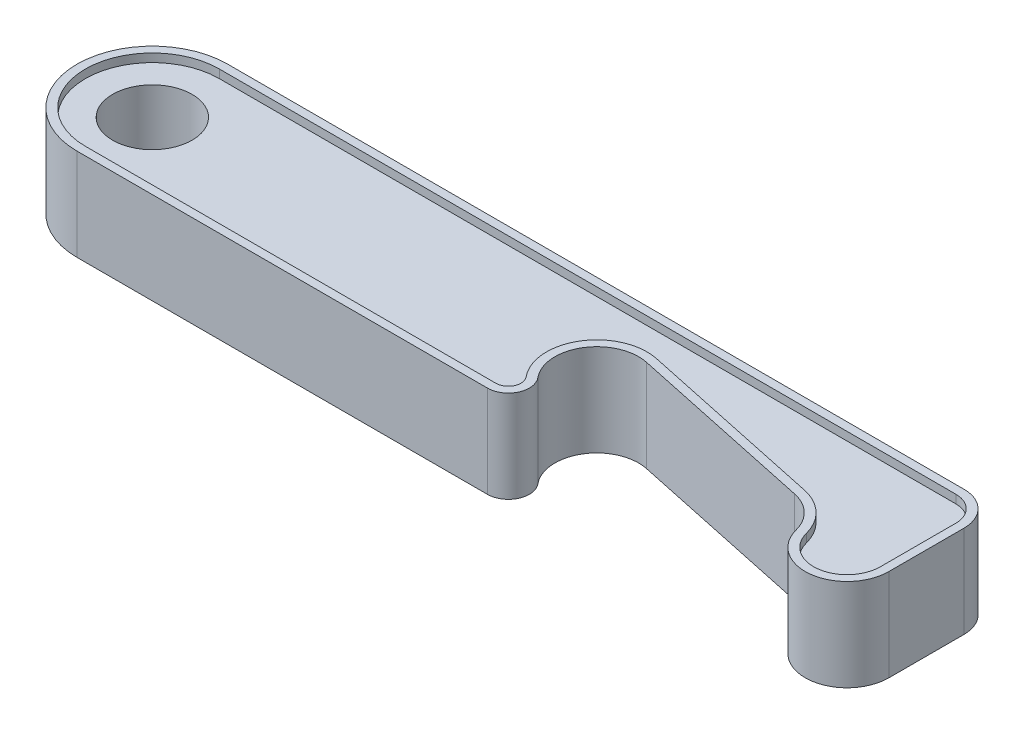
ISO-10303-21;
HEADER;
FILE_DESCRIPTION(('STEP AP214'),'2;1');
FILE_NAME('part.step','',(''),(''),'','','');
FILE_SCHEMA(('AUTOMOTIVE_DESIGN { 1 0 10303 214 1 1 1 1 }'));
ENDSEC;
DATA;
#1=APPLICATION_CONTEXT('core data for automotive mechanical design processes');
#2=APPLICATION_PROTOCOL_DEFINITION('international standard','automotive_design',2000,#1);
#3=PRODUCT_CONTEXT('',#1,'mechanical');
#4=PRODUCT('Part','Part','',(#3));
#5=PRODUCT_RELATED_PRODUCT_CATEGORY('part','',(#4));
#6=PRODUCT_DEFINITION_FORMATION('','',#4);
#7=PRODUCT_DEFINITION_CONTEXT('part definition',#1,'design');
#8=PRODUCT_DEFINITION('design','',#6,#7);
#9=PRODUCT_DEFINITION_SHAPE('','',#8);
#10=(LENGTH_UNIT() NAMED_UNIT(*) SI_UNIT(.MILLI.,.METRE.));
#11=(NAMED_UNIT(*) PLANE_ANGLE_UNIT() SI_UNIT($,.RADIAN.));
#12=(NAMED_UNIT(*) SI_UNIT($,.STERADIAN.) SOLID_ANGLE_UNIT());
#13=UNCERTAINTY_MEASURE_WITH_UNIT(LENGTH_MEASURE(1.E-05),#10,'distance_accuracy_value','');
#14=(GEOMETRIC_REPRESENTATION_CONTEXT(3) GLOBAL_UNCERTAINTY_ASSIGNED_CONTEXT((#13)) GLOBAL_UNIT_ASSIGNED_CONTEXT((#10,
#11,#12)) REPRESENTATION_CONTEXT('',''));
#15=CARTESIAN_POINT('',(0.,0.,0.));
#16=DIRECTION('',(0.,0.,1.));
#17=DIRECTION('',(1.,0.,0.));
#18=AXIS2_PLACEMENT_3D('',#15,#16,#17);
#19=CARTESIAN_POINT('',(0.,4.5,0.));
#20=DIRECTION('',(0.,-1.,0.));
#21=DIRECTION('',(0.,0.,-1.));
#22=AXIS2_PLACEMENT_3D('',#19,#20,#21);
#23=CYLINDRICAL_SURFACE('',#22,4.75);
#24=CARTESIAN_POINT('',(0.,4.5,0.));
#25=DIRECTION('',(0.,1.,0.));
#26=DIRECTION('',(0.,0.,1.));
#27=AXIS2_PLACEMENT_3D('',#24,#25,#26);
#28=CIRCLE('',#27,4.75);
#29=CARTESIAN_POINT('',(0.,4.5,4.75));
#30=VERTEX_POINT('',#29);
#31=EDGE_CURVE('E94',#30,#30,#28,.T.);
#32=ORIENTED_EDGE('',*,*,#31,.T.);
#33=EDGE_LOOP('',(#32));
#34=FACE_BOUND('',#33,.T.);
#35=CARTESIAN_POINT('',(0.,-4.5,0.));
#36=DIRECTION('',(0.,1.,0.));
#37=DIRECTION('',(0.,0.,1.));
#38=AXIS2_PLACEMENT_3D('',#35,#36,#37);
#39=CIRCLE('',#38,4.75);
#40=CARTESIAN_POINT('',(0.,-4.5,4.75));
#41=VERTEX_POINT('',#40);
#42=EDGE_CURVE('E154',#41,#41,#39,.T.);
#43=ORIENTED_EDGE('',*,*,#42,.F.);
#44=EDGE_LOOP('',(#43));
#45=FACE_BOUND('',#44,.T.);
#46=ADVANCED_FACE('F36',(#34,#45),#23,.F.);
#47=CARTESIAN_POINT('',(0.,4.5,0.));
#48=DIRECTION('',(0.,1.,0.));
#49=DIRECTION('',(0.,0.,1.));
#50=AXIS2_PLACEMENT_3D('',#47,#48,#49);
#51=PLANE('',#50);
#52=ORIENTED_EDGE('',*,*,#31,.F.);
#53=EDGE_LOOP('',(#52));
#54=FACE_BOUND('',#53,.T.);
#55=DIRECTION('',(1.,0.,0.));
#56=VECTOR('',#55,1.);
#57=CARTESIAN_POINT('',(0.,4.5,-8.));
#58=LINE('',#57,#56);
#59=CARTESIAN_POINT('',(0.,4.5,-8.));
#60=VERTEX_POINT('',#59);
#61=CARTESIAN_POINT('',(88.,4.5,-8.));
#62=VERTEX_POINT('',#61);
#63=EDGE_CURVE('E129',#60,#62,#58,.T.);
#64=ORIENTED_EDGE('',*,*,#63,.F.);
#65=CARTESIAN_POINT('',(0.,4.5,0.));
#66=DIRECTION('',(0.,1.,0.));
#67=DIRECTION('',(0.,0.,1.));
#68=AXIS2_PLACEMENT_3D('',#65,#66,#67);
#69=CIRCLE('',#68,8.);
#70=CARTESIAN_POINT('',(0.,4.5,8.));
#71=VERTEX_POINT('',#70);
#72=EDGE_CURVE('E132',#60,#71,#69,.T.);
#73=ORIENTED_EDGE('',*,*,#72,.T.);
#74=DIRECTION('',(1.,0.,0.));
#75=VECTOR('',#74,1.);
#76=CARTESIAN_POINT('',(0.,4.5,8.));
#77=LINE('',#76,#75);
#78=CARTESIAN_POINT('',(49.0402172346334,4.5,8.));
#79=VERTEX_POINT('',#78);
#80=EDGE_CURVE('E135',#71,#79,#77,.T.);
#81=ORIENTED_EDGE('',*,*,#80,.T.);
#82=CARTESIAN_POINT('',(49.0402172346334,4.5,6.5));
#83=DIRECTION('',(0.,1.,0.));
#84=DIRECTION('',(0.,0.,1.));
#85=AXIS2_PLACEMENT_3D('',#82,#83,#84);
#86=CIRCLE('',#85,1.5);
#87=CARTESIAN_POINT('',(50.195682114603,4.5,5.54349547248493));
#88=VERTEX_POINT('',#87);
#89=EDGE_CURVE('E138',#88,#79,#86,.F.);
#90=ORIENTED_EDGE('',*,*,#89,.F.);
#91=CARTESIAN_POINT('',(54.8175416344815,4.5,1.71747736242466));
#92=DIRECTION('',(0.,1.,0.));
#93=DIRECTION('',(0.,0.,1.));
#94=AXIS2_PLACEMENT_3D('',#91,#92,#93);
#95=CIRCLE('',#94,6.);
#96=CARTESIAN_POINT('',(56.065011779388,4.5,-4.15140824197818));
#97=VERTEX_POINT('',#96);
#98=EDGE_CURVE('E140',#97,#88,#95,.T.);
#99=ORIENTED_EDGE('',*,*,#98,.F.);
#100=DIRECTION('',(-0.978147600733807,0.,-0.207911690817753));
#101=VECTOR('',#100,1.);
#102=CARTESIAN_POINT('',(3.26780239401411,4.5,-15.3738015347051));
#103=LINE('',#102,#101);
#104=CARTESIAN_POINT('',(78.565011779388,4.5,0.631114395597154));
#105=VERTEX_POINT('',#104);
#106=EDGE_CURVE('E143',#105,#97,#103,.T.);
#107=ORIENTED_EDGE('',*,*,#106,.F.);
#108=CARTESIAN_POINT('',(77.3175416344815,4.5,6.5));
#109=DIRECTION('',(0.,1.,0.));
#110=DIRECTION('',(0.,0.,1.));
#111=AXIS2_PLACEMENT_3D('',#108,#109,#110);
#112=CIRCLE('',#111,6.);
#113=CARTESIAN_POINT('',(83.1270166537926,4.5,5.));
#114=VERTEX_POINT('',#113);
#115=EDGE_CURVE('E146',#114,#105,#112,.T.);
#116=ORIENTED_EDGE('',*,*,#115,.F.);
#117=CARTESIAN_POINT('',(87.,4.5,4.));
#118=DIRECTION('',(0.,1.,0.));
#119=DIRECTION('',(0.,0.,1.));
#120=AXIS2_PLACEMENT_3D('',#117,#118,#119);
#121=CIRCLE('',#120,4.);
#122=CARTESIAN_POINT('',(91.,4.5,4.));
#123=VERTEX_POINT('',#122);
#124=EDGE_CURVE('E149',#123,#114,#121,.F.);
#125=ORIENTED_EDGE('',*,*,#124,.F.);
#126=DIRECTION('',(0.,0.,1.));
#127=VECTOR('',#126,1.);
#128=CARTESIAN_POINT('',(91.,4.5,0.));
#129=LINE('',#128,#127);
#130=CARTESIAN_POINT('',(91.,4.5,-5.));
#131=VERTEX_POINT('',#130);
#132=EDGE_CURVE('E45',#131,#123,#129,.T.);
#133=ORIENTED_EDGE('',*,*,#132,.F.);
#134=CARTESIAN_POINT('',(88.,4.5,-5.));
#135=DIRECTION('',(0.,1.,0.));
#136=DIRECTION('',(0.,0.,1.));
#137=AXIS2_PLACEMENT_3D('',#134,#135,#136);
#138=CIRCLE('',#137,3.);
#139=EDGE_CURVE('E11',#62,#131,#138,.F.);
#140=ORIENTED_EDGE('',*,*,#139,.F.);
#141=EDGE_LOOP('',(#64,#73,#81,#90,#99,#107,#116,#125,#133,#140));
#142=FACE_BOUND('',#141,.T.);
#143=ADVANCED_FACE('F470',(#54,#142),#51,.T.);
#144=CARTESIAN_POINT('',(0.,-4.5,0.));
#145=DIRECTION('',(0.,1.,0.));
#146=DIRECTION('',(0.,0.,1.));
#147=AXIS2_PLACEMENT_3D('',#144,#145,#146);
#148=PLANE('',#147);
#149=ORIENTED_EDGE('',*,*,#42,.T.);
#150=EDGE_LOOP('',(#149));
#151=FACE_BOUND('',#150,.T.);
#152=DIRECTION('',(1.,0.,0.));
#153=VECTOR('',#152,1.);
#154=CARTESIAN_POINT('',(0.,-4.5,-8.));
#155=LINE('',#154,#153);
#156=CARTESIAN_POINT('',(0.,-4.5,-8.));
#157=VERTEX_POINT('',#156);
#158=CARTESIAN_POINT('',(88.,-4.5,-8.));
#159=VERTEX_POINT('',#158);
#160=EDGE_CURVE('E89',#157,#159,#155,.T.);
#161=ORIENTED_EDGE('',*,*,#160,.T.);
#162=CARTESIAN_POINT('',(88.,-4.5,-5.));
#163=DIRECTION('',(0.,1.,0.));
#164=DIRECTION('',(0.,0.,1.));
#165=AXIS2_PLACEMENT_3D('',#162,#163,#164);
#166=CIRCLE('',#165,3.);
#167=CARTESIAN_POINT('',(91.,-4.5,-5.));
#168=VERTEX_POINT('',#167);
#169=EDGE_CURVE('E39',#159,#168,#166,.F.);
#170=ORIENTED_EDGE('',*,*,#169,.T.);
#171=DIRECTION('',(0.,0.,1.));
#172=VECTOR('',#171,1.);
#173=CARTESIAN_POINT('',(91.,-4.5,0.));
#174=LINE('',#173,#172);
#175=CARTESIAN_POINT('',(91.,-4.5,4.));
#176=VERTEX_POINT('',#175);
#177=EDGE_CURVE('E86',#168,#176,#174,.T.);
#178=ORIENTED_EDGE('',*,*,#177,.T.);
#179=CARTESIAN_POINT('',(87.,-4.5,4.));
#180=DIRECTION('',(0.,1.,0.));
#181=DIRECTION('',(0.,0.,1.));
#182=AXIS2_PLACEMENT_3D('',#179,#180,#181);
#183=CIRCLE('',#182,4.);
#184=CARTESIAN_POINT('',(83.1270166537926,-4.5,5.));
#185=VERTEX_POINT('',#184);
#186=EDGE_CURVE('E105',#176,#185,#183,.F.);
#187=ORIENTED_EDGE('',*,*,#186,.T.);
#188=CARTESIAN_POINT('',(77.3175416344815,-4.5,6.5));
#189=DIRECTION('',(0.,1.,0.));
#190=DIRECTION('',(0.,0.,1.));
#191=AXIS2_PLACEMENT_3D('',#188,#189,#190);
#192=CIRCLE('',#191,6.);
#193=CARTESIAN_POINT('',(78.565011779388,-4.5,0.631114395597154));
#194=VERTEX_POINT('',#193);
#195=EDGE_CURVE('E172',#185,#194,#192,.T.);
#196=ORIENTED_EDGE('',*,*,#195,.T.);
#197=DIRECTION('',(-0.978147600733807,0.,-0.207911690817753));
#198=VECTOR('',#197,1.);
#199=CARTESIAN_POINT('',(3.26780239401411,-4.5,-15.3738015347051));
#200=LINE('',#199,#198);
#201=CARTESIAN_POINT('',(56.065011779388,-4.5,-4.15140824197818));
#202=VERTEX_POINT('',#201);
#203=EDGE_CURVE('E170',#194,#202,#200,.T.);
#204=ORIENTED_EDGE('',*,*,#203,.T.);
#205=CARTESIAN_POINT('',(54.8175416344815,-4.5,1.71747736242466));
#206=DIRECTION('',(0.,1.,0.));
#207=DIRECTION('',(0.,0.,1.));
#208=AXIS2_PLACEMENT_3D('',#205,#206,#207);
#209=CIRCLE('',#208,6.);
#210=CARTESIAN_POINT('',(50.195682114603,-4.5,5.54349547248493));
#211=VERTEX_POINT('',#210);
#212=EDGE_CURVE('E168',#202,#211,#209,.T.);
#213=ORIENTED_EDGE('',*,*,#212,.T.);
#214=CARTESIAN_POINT('',(49.0402172346334,-4.5,6.5));
#215=DIRECTION('',(0.,1.,0.));
#216=DIRECTION('',(0.,0.,1.));
#217=AXIS2_PLACEMENT_3D('',#214,#215,#216);
#218=CIRCLE('',#217,1.5);
#219=CARTESIAN_POINT('',(49.0402172346334,-4.5,8.));
#220=VERTEX_POINT('',#219);
#221=EDGE_CURVE('E165',#211,#220,#218,.F.);
#222=ORIENTED_EDGE('',*,*,#221,.T.);
#223=DIRECTION('',(1.,0.,0.));
#224=VECTOR('',#223,1.);
#225=CARTESIAN_POINT('',(0.,-4.5,8.));
#226=LINE('',#225,#224);
#227=CARTESIAN_POINT('',(0.,-4.5,8.));
#228=VERTEX_POINT('',#227);
#229=EDGE_CURVE('E162',#228,#220,#226,.T.);
#230=ORIENTED_EDGE('',*,*,#229,.F.);
#231=CARTESIAN_POINT('',(0.,-4.5,0.));
#232=DIRECTION('',(0.,1.,0.));
#233=DIRECTION('',(0.,0.,1.));
#234=AXIS2_PLACEMENT_3D('',#231,#232,#233);
#235=CIRCLE('',#234,8.);
#236=EDGE_CURVE('E159',#157,#228,#235,.T.);
#237=ORIENTED_EDGE('',*,*,#236,.F.);
#238=EDGE_LOOP('',(#161,#170,#178,#187,#196,#204,#213,#222,#230,#237));
#239=FACE_BOUND('',#238,.T.);
#240=ADVANCED_FACE('F85',(#151,#239),#148,.F.);
#241=CARTESIAN_POINT('',(0.,5.5,0.));
#242=DIRECTION('',(0.,-1.,0.));
#243=DIRECTION('',(0.,0.,-1.));
#244=AXIS2_PLACEMENT_3D('',#241,#242,#243);
#245=CYLINDRICAL_SURFACE('',#244,8.);
#246=ORIENTED_EDGE('',*,*,#236,.T.);
#247=DIRECTION('',(0.,-1.,0.));
#248=VECTOR('',#247,1.);
#249=CARTESIAN_POINT('',(0.,5.5,8.));
#250=LINE('',#249,#248);
#251=CARTESIAN_POINT('',(0.,-5.5,8.));
#252=VERTEX_POINT('',#251);
#253=EDGE_CURVE('E211',#228,#252,#250,.T.);
#254=ORIENTED_EDGE('',*,*,#253,.T.);
#255=CARTESIAN_POINT('',(0.,-5.5,0.));
#256=DIRECTION('',(0.,1.,0.));
#257=DIRECTION('',(0.,0.,1.));
#258=AXIS2_PLACEMENT_3D('',#255,#256,#257);
#259=CIRCLE('',#258,8.);
#260=CARTESIAN_POINT('',(0.,-5.5,-8.));
#261=VERTEX_POINT('',#260);
#262=EDGE_CURVE('E292',#261,#252,#259,.T.);
#263=ORIENTED_EDGE('',*,*,#262,.F.);
#264=DIRECTION('',(0.,-1.,0.));
#265=VECTOR('',#264,1.);
#266=CARTESIAN_POINT('',(0.,5.5,-8.));
#267=LINE('',#266,#265);
#268=EDGE_CURVE('E122',#157,#261,#267,.T.);
#269=ORIENTED_EDGE('',*,*,#268,.F.);
#270=EDGE_LOOP('',(#246,#254,#263,#269));
#271=FACE_BOUND('',#270,.T.);
#272=ADVANCED_FACE('F534',(#271),#245,.F.);
#273=CARTESIAN_POINT('',(0.,5.5,-8.));
#274=DIRECTION('',(0.,0.,-1.));
#275=DIRECTION('',(-1.,0.,0.));
#276=AXIS2_PLACEMENT_3D('',#273,#274,#275);
#277=PLANE('',#276);
#278=DIRECTION('',(0.,-1.,0.));
#279=VECTOR('',#278,1.);
#280=CARTESIAN_POINT('',(88.,5.5,-8.));
#281=LINE('',#280,#279);
#282=CARTESIAN_POINT('',(88.,-5.5,-8.));
#283=VERTEX_POINT('',#282);
#284=EDGE_CURVE('E114',#159,#283,#281,.T.);
#285=ORIENTED_EDGE('',*,*,#284,.F.);
#286=ORIENTED_EDGE('',*,*,#160,.F.);
#287=ORIENTED_EDGE('',*,*,#268,.T.);
#288=DIRECTION('',(1.,0.,0.));
#289=VECTOR('',#288,1.);
#290=CARTESIAN_POINT('',(0.,-5.5,-8.));
#291=LINE('',#290,#289);
#292=EDGE_CURVE('E289',#261,#283,#291,.T.);
#293=ORIENTED_EDGE('',*,*,#292,.T.);
#294=EDGE_LOOP('',(#285,#286,#287,#293));
#295=FACE_BOUND('',#294,.T.);
#296=ADVANCED_FACE('F538',(#295),#277,.F.);
#297=CARTESIAN_POINT('',(88.,5.5,-5.));
#298=DIRECTION('',(0.,-1.,0.));
#299=DIRECTION('',(0.,0.,-1.));
#300=AXIS2_PLACEMENT_3D('',#297,#298,#299);
#301=CYLINDRICAL_SURFACE('',#300,3.);
#302=DIRECTION('',(0.,-1.,0.));
#303=VECTOR('',#302,1.);
#304=CARTESIAN_POINT('',(91.,5.5,-5.));
#305=LINE('',#304,#303);
#306=CARTESIAN_POINT('',(91.,-5.5,-5.));
#307=VERTEX_POINT('',#306);
#308=EDGE_CURVE('E101',#168,#307,#305,.T.);
#309=ORIENTED_EDGE('',*,*,#308,.F.);
#310=ORIENTED_EDGE('',*,*,#169,.F.);
#311=ORIENTED_EDGE('',*,*,#284,.T.);
#312=CARTESIAN_POINT('',(88.,-5.5,-5.));
#313=DIRECTION('',(0.,1.,0.));
#314=DIRECTION('',(0.,0.,1.));
#315=AXIS2_PLACEMENT_3D('',#312,#313,#314);
#316=CIRCLE('',#315,3.);
#317=EDGE_CURVE('E108',#283,#307,#316,.F.);
#318=ORIENTED_EDGE('',*,*,#317,.T.);
#319=EDGE_LOOP('',(#309,#310,#311,#318));
#320=FACE_BOUND('',#319,.T.);
#321=ADVANCED_FACE('F106',(#320),#301,.F.);
#322=CARTESIAN_POINT('',(91.,5.5,0.));
#323=DIRECTION('',(1.,0.,0.));
#324=DIRECTION('',(0.,0.,-1.));
#325=AXIS2_PLACEMENT_3D('',#322,#323,#324);
#326=PLANE('',#325);
#327=DIRECTION('',(0.,-1.,0.));
#328=VECTOR('',#327,1.);
#329=CARTESIAN_POINT('',(91.,5.5,4.));
#330=LINE('',#329,#328);
#331=CARTESIAN_POINT('',(91.,-5.5,4.));
#332=VERTEX_POINT('',#331);
#333=EDGE_CURVE('E104',#176,#332,#330,.T.);
#334=ORIENTED_EDGE('',*,*,#333,.F.);
#335=ORIENTED_EDGE('',*,*,#177,.F.);
#336=ORIENTED_EDGE('',*,*,#308,.T.);
#337=DIRECTION('',(0.,0.,1.));
#338=VECTOR('',#337,1.);
#339=CARTESIAN_POINT('',(91.,-5.5,0.));
#340=LINE('',#339,#338);
#341=EDGE_CURVE('E286',#307,#332,#340,.T.);
#342=ORIENTED_EDGE('',*,*,#341,.T.);
#343=EDGE_LOOP('',(#334,#335,#336,#342));
#344=FACE_BOUND('',#343,.T.);
#345=ADVANCED_FACE('F98',(#344),#326,.F.);
#346=CARTESIAN_POINT('',(87.,5.5,4.));
#347=DIRECTION('',(0.,-1.,0.));
#348=DIRECTION('',(0.,0.,-1.));
#349=AXIS2_PLACEMENT_3D('',#346,#347,#348);
#350=CYLINDRICAL_SURFACE('',#349,4.);
#351=DIRECTION('',(0.,-1.,0.));
#352=VECTOR('',#351,1.);
#353=CARTESIAN_POINT('',(83.1270166537926,5.5,5.));
#354=LINE('',#353,#352);
#355=CARTESIAN_POINT('',(83.1270166537926,-5.5,5.));
#356=VERTEX_POINT('',#355);
#357=EDGE_CURVE('E184',#185,#356,#354,.T.);
#358=ORIENTED_EDGE('',*,*,#357,.F.);
#359=ORIENTED_EDGE('',*,*,#186,.F.);
#360=ORIENTED_EDGE('',*,*,#333,.T.);
#361=CARTESIAN_POINT('',(87.,-5.5,4.));
#362=DIRECTION('',(0.,1.,0.));
#363=DIRECTION('',(0.,0.,1.));
#364=AXIS2_PLACEMENT_3D('',#361,#362,#363);
#365=CIRCLE('',#364,4.);
#366=EDGE_CURVE('E190',#332,#356,#365,.F.);
#367=ORIENTED_EDGE('',*,*,#366,.T.);
#368=EDGE_LOOP('',(#358,#359,#360,#367));
#369=FACE_BOUND('',#368,.T.);
#370=ADVANCED_FACE('F188',(#369),#350,.F.);
#371=CARTESIAN_POINT('',(77.3175416344815,5.5,6.5));
#372=DIRECTION('',(0.,-1.,0.));
#373=DIRECTION('',(0.,0.,-1.));
#374=AXIS2_PLACEMENT_3D('',#371,#372,#373);
#375=CYLINDRICAL_SURFACE('',#374,6.);
#376=DIRECTION('',(0.,-1.,0.));
#377=VECTOR('',#376,1.);
#378=CARTESIAN_POINT('',(78.565011779388,5.5,0.631114395597154));
#379=LINE('',#378,#377);
#380=CARTESIAN_POINT('',(78.565011779388,-5.5,0.631114395597154));
#381=VERTEX_POINT('',#380);
#382=EDGE_CURVE('E187',#194,#381,#379,.T.);
#383=ORIENTED_EDGE('',*,*,#382,.F.);
#384=ORIENTED_EDGE('',*,*,#195,.F.);
#385=ORIENTED_EDGE('',*,*,#357,.T.);
#386=CARTESIAN_POINT('',(77.3175416344815,-5.5,6.5));
#387=DIRECTION('',(0.,1.,0.));
#388=DIRECTION('',(0.,0.,1.));
#389=AXIS2_PLACEMENT_3D('',#386,#387,#388);
#390=CIRCLE('',#389,6.);
#391=EDGE_CURVE('E283',#356,#381,#390,.T.);
#392=ORIENTED_EDGE('',*,*,#391,.T.);
#393=EDGE_LOOP('',(#383,#384,#385,#392));
#394=FACE_BOUND('',#393,.T.);
#395=ADVANCED_FACE('F181',(#394),#375,.T.);
#396=CARTESIAN_POINT('',(3.26780239401411,5.5,-15.3738015347051));
#397=DIRECTION('',(-0.207911690817753,0.,0.978147600733807));
#398=DIRECTION('',(0.978147600733807,0.,0.207911690817753));
#399=AXIS2_PLACEMENT_3D('',#396,#397,#398);
#400=PLANE('',#399);
#401=DIRECTION('',(0.,-1.,0.));
#402=VECTOR('',#401,1.);
#403=CARTESIAN_POINT('',(56.065011779388,5.5,-4.15140824197818));
#404=LINE('',#403,#402);
#405=CARTESIAN_POINT('',(56.065011779388,-5.5,-4.15140824197818));
#406=VERTEX_POINT('',#405);
#407=EDGE_CURVE('E201',#202,#406,#404,.T.);
#408=ORIENTED_EDGE('',*,*,#407,.F.);
#409=ORIENTED_EDGE('',*,*,#203,.F.);
#410=ORIENTED_EDGE('',*,*,#382,.T.);
#411=DIRECTION('',(-0.978147600733807,0.,-0.207911690817753));
#412=VECTOR('',#411,1.);
#413=CARTESIAN_POINT('',(3.26780239401411,-5.5,-15.3738015347051));
#414=LINE('',#413,#412);
#415=EDGE_CURVE('E280',#381,#406,#414,.T.);
#416=ORIENTED_EDGE('',*,*,#415,.T.);
#417=EDGE_LOOP('',(#408,#409,#410,#416));
#418=FACE_BOUND('',#417,.T.);
#419=ADVANCED_FACE('F568',(#418),#400,.F.);
#420=CARTESIAN_POINT('',(54.8175416344815,5.5,1.71747736242466));
#421=DIRECTION('',(0.,-1.,0.));
#422=DIRECTION('',(0.,0.,-1.));
#423=AXIS2_PLACEMENT_3D('',#420,#421,#422);
#424=CYLINDRICAL_SURFACE('',#423,6.);
#425=DIRECTION('',(0.,-1.,0.));
#426=VECTOR('',#425,1.);
#427=CARTESIAN_POINT('',(50.195682114603,5.5,5.54349547248493));
#428=LINE('',#427,#426);
#429=CARTESIAN_POINT('',(50.195682114603,-5.5,5.54349547248493));
#430=VERTEX_POINT('',#429);
#431=EDGE_CURVE('E205',#211,#430,#428,.T.);
#432=ORIENTED_EDGE('',*,*,#431,.F.);
#433=ORIENTED_EDGE('',*,*,#212,.F.);
#434=ORIENTED_EDGE('',*,*,#407,.T.);
#435=CARTESIAN_POINT('',(54.8175416344815,-5.5,1.71747736242466));
#436=DIRECTION('',(0.,1.,0.));
#437=DIRECTION('',(0.,0.,1.));
#438=AXIS2_PLACEMENT_3D('',#435,#436,#437);
#439=CIRCLE('',#438,6.);
#440=EDGE_CURVE('E277',#406,#430,#439,.T.);
#441=ORIENTED_EDGE('',*,*,#440,.T.);
#442=EDGE_LOOP('',(#432,#433,#434,#441));
#443=FACE_BOUND('',#442,.T.);
#444=ADVANCED_FACE('F573',(#443),#424,.T.);
#445=CARTESIAN_POINT('',(49.0402172346334,5.5,6.5));
#446=DIRECTION('',(0.,-1.,0.));
#447=DIRECTION('',(0.,0.,-1.));
#448=AXIS2_PLACEMENT_3D('',#445,#446,#447);
#449=CYLINDRICAL_SURFACE('',#448,1.5);
#450=DIRECTION('',(0.,-1.,0.));
#451=VECTOR('',#450,1.);
#452=CARTESIAN_POINT('',(49.0402172346334,5.5,8.));
#453=LINE('',#452,#451);
#454=CARTESIAN_POINT('',(49.0402172346334,-5.5,8.));
#455=VERTEX_POINT('',#454);
#456=EDGE_CURVE('E207',#220,#455,#453,.T.);
#457=ORIENTED_EDGE('',*,*,#456,.F.);
#458=ORIENTED_EDGE('',*,*,#221,.F.);
#459=ORIENTED_EDGE('',*,*,#431,.T.);
#460=CARTESIAN_POINT('',(49.0402172346334,-5.5,6.5));
#461=DIRECTION('',(0.,1.,0.));
#462=DIRECTION('',(0.,0.,1.));
#463=AXIS2_PLACEMENT_3D('',#460,#461,#462);
#464=CIRCLE('',#463,1.5);
#465=EDGE_CURVE('E274',#430,#455,#464,.F.);
#466=ORIENTED_EDGE('',*,*,#465,.T.);
#467=EDGE_LOOP('',(#457,#458,#459,#466));
#468=FACE_BOUND('',#467,.T.);
#469=ADVANCED_FACE('F576',(#468),#449,.F.);
#470=CARTESIAN_POINT('',(0.,5.5,8.));
#471=DIRECTION('',(0.,0.,-1.));
#472=DIRECTION('',(-1.,0.,0.));
#473=AXIS2_PLACEMENT_3D('',#470,#471,#472);
#474=PLANE('',#473);
#475=ORIENTED_EDGE('',*,*,#229,.T.);
#476=ORIENTED_EDGE('',*,*,#456,.T.);
#477=DIRECTION('',(1.,0.,0.));
#478=VECTOR('',#477,1.);
#479=CARTESIAN_POINT('',(0.,-5.5,8.));
#480=LINE('',#479,#478);
#481=EDGE_CURVE('E271',#252,#455,#480,.T.);
#482=ORIENTED_EDGE('',*,*,#481,.F.);
#483=ORIENTED_EDGE('',*,*,#253,.F.);
#484=EDGE_LOOP('',(#475,#476,#482,#483));
#485=FACE_BOUND('',#484,.T.);
#486=ADVANCED_FACE('F579',(#485),#474,.T.);
#487=CARTESIAN_POINT('',(49.0402172346334,5.5,6.5));
#488=DIRECTION('',(0.,-1.,0.));
#489=DIRECTION('',(0.,0.,-1.));
#490=AXIS2_PLACEMENT_3D('',#487,#488,#489);
#491=CYLINDRICAL_SURFACE('',#490,2.5);
#492=CARTESIAN_POINT('',(49.0402172346334,-5.5,6.5));
#493=DIRECTION('',(0.,1.,0.));
#494=DIRECTION('',(0.,0.,1.));
#495=AXIS2_PLACEMENT_3D('',#492,#493,#494);
#496=CIRCLE('',#495,2.5);
#497=CARTESIAN_POINT('',(50.9659920345828,-5.5,4.90582578747489));
#498=VERTEX_POINT('',#497);
#499=CARTESIAN_POINT('',(49.0402172346334,-5.5,9.));
#500=VERTEX_POINT('',#499);
#501=EDGE_CURVE('E268',#498,#500,#496,.F.);
#502=ORIENTED_EDGE('',*,*,#501,.F.);
#503=DIRECTION('',(0.,-1.,0.));
#504=VECTOR('',#503,1.);
#505=CARTESIAN_POINT('',(50.9659920345828,5.5,4.90582578747489));
#506=LINE('',#505,#504);
#507=CARTESIAN_POINT('',(50.9659920345828,5.5,4.90582578747489));
#508=VERTEX_POINT('',#507);
#509=EDGE_CURVE('E157',#508,#498,#506,.T.);
#510=ORIENTED_EDGE('',*,*,#509,.F.);
#511=CARTESIAN_POINT('',(49.0402172346334,5.5,6.5));
#512=DIRECTION('',(0.,1.,0.));
#513=DIRECTION('',(0.,0.,1.));
#514=AXIS2_PLACEMENT_3D('',#511,#512,#513);
#515=CIRCLE('',#514,2.5);
#516=CARTESIAN_POINT('',(49.0402172346334,5.5,9.));
#517=VERTEX_POINT('',#516);
#518=EDGE_CURVE('E322',#508,#517,#515,.F.);
#519=ORIENTED_EDGE('',*,*,#518,.T.);
#520=DIRECTION('',(0.,-1.,0.));
#521=VECTOR('',#520,1.);
#522=CARTESIAN_POINT('',(49.0402172346334,5.5,9.));
#523=LINE('',#522,#521);
#524=EDGE_CURVE('E126',#517,#500,#523,.T.);
#525=ORIENTED_EDGE('',*,*,#524,.T.);
#526=EDGE_LOOP('',(#502,#510,#519,#525));
#527=FACE_BOUND('',#526,.T.);
#528=ADVANCED_FACE('F582',(#527),#491,.T.);
#529=CARTESIAN_POINT('',(54.8175416344815,5.5,1.71747736242466));
#530=DIRECTION('',(0.,-1.,0.));
#531=DIRECTION('',(0.,0.,-1.));
#532=AXIS2_PLACEMENT_3D('',#529,#530,#531);
#533=CYLINDRICAL_SURFACE('',#532,5.);
#534=CARTESIAN_POINT('',(54.8175416344815,-5.5,1.71747736242466));
#535=DIRECTION('',(0.,1.,0.));
#536=DIRECTION('',(0.,0.,1.));
#537=AXIS2_PLACEMENT_3D('',#534,#535,#536);
#538=CIRCLE('',#537,5.);
#539=CARTESIAN_POINT('',(55.8571000885702,-5.5,-3.17326064124438));
#540=VERTEX_POINT('',#539);
#541=EDGE_CURVE('E265',#540,#498,#538,.T.);
#542=ORIENTED_EDGE('',*,*,#541,.F.);
#543=DIRECTION('',(0.,-1.,0.));
#544=VECTOR('',#543,1.);
#545=CARTESIAN_POINT('',(55.8571000885702,5.5,-3.17326064124438));
#546=LINE('',#545,#544);
#547=CARTESIAN_POINT('',(55.8571000885702,5.5,-3.17326064124438));
#548=VERTEX_POINT('',#547);
#549=EDGE_CURVE('E214',#548,#540,#546,.T.);
#550=ORIENTED_EDGE('',*,*,#549,.F.);
#551=CARTESIAN_POINT('',(54.8175416344815,5.5,1.71747736242466));
#552=DIRECTION('',(0.,1.,0.));
#553=DIRECTION('',(0.,0.,1.));
#554=AXIS2_PLACEMENT_3D('',#551,#552,#553);
#555=CIRCLE('',#554,5.);
#556=EDGE_CURVE('E319',#548,#508,#555,.T.);
#557=ORIENTED_EDGE('',*,*,#556,.T.);
#558=ORIENTED_EDGE('',*,*,#509,.T.);
#559=EDGE_LOOP('',(#542,#550,#557,#558));
#560=FACE_BOUND('',#559,.T.);
#561=ADVANCED_FACE('F588',(#560),#533,.F.);
#562=CARTESIAN_POINT('',(3.05989070319636,5.5,-14.3956539339713));
#563=DIRECTION('',(-0.207911690817753,0.,0.978147600733807));
#564=DIRECTION('',(0.978147600733807,0.,0.207911690817753));
#565=AXIS2_PLACEMENT_3D('',#562,#563,#564);
#566=PLANE('',#565);
#567=DIRECTION('',(-0.978147600733807,0.,-0.207911690817753));
#568=VECTOR('',#567,1.);
#569=CARTESIAN_POINT('',(3.05989070319636,-5.5,-14.3956539339713));
#570=LINE('',#569,#568);
#571=CARTESIAN_POINT('',(78.3571000885702,-5.5,1.60926199633096));
#572=VERTEX_POINT('',#571);
#573=EDGE_CURVE('E262',#572,#540,#570,.T.);
#574=ORIENTED_EDGE('',*,*,#573,.F.);
#575=DIRECTION('',(0.,-1.,0.));
#576=VECTOR('',#575,1.);
#577=CARTESIAN_POINT('',(78.3571000885702,5.5,1.60926199633096));
#578=LINE('',#577,#576);
#579=CARTESIAN_POINT('',(78.3571000885702,5.5,1.60926199633096));
#580=VERTEX_POINT('',#579);
#581=EDGE_CURVE('E217',#580,#572,#578,.T.);
#582=ORIENTED_EDGE('',*,*,#581,.F.);
#583=DIRECTION('',(-0.978147600733807,0.,-0.207911690817753));
#584=VECTOR('',#583,1.);
#585=CARTESIAN_POINT('',(3.05989070319636,5.5,-14.3956539339713));
#586=LINE('',#585,#584);
#587=EDGE_CURVE('E316',#580,#548,#586,.T.);
#588=ORIENTED_EDGE('',*,*,#587,.T.);
#589=ORIENTED_EDGE('',*,*,#549,.T.);
#590=EDGE_LOOP('',(#574,#582,#588,#589));
#591=FACE_BOUND('',#590,.T.);
#592=ADVANCED_FACE('F688',(#591),#566,.T.);
#593=CARTESIAN_POINT('',(77.3175416344815,5.5,6.5));
#594=DIRECTION('',(0.,-1.,0.));
#595=DIRECTION('',(0.,0.,-1.));
#596=AXIS2_PLACEMENT_3D('',#593,#594,#595);
#597=CYLINDRICAL_SURFACE('',#596,5.);
#598=CARTESIAN_POINT('',(77.3175416344815,-5.5,6.5));
#599=DIRECTION('',(0.,1.,0.));
#600=DIRECTION('',(0.,0.,1.));
#601=AXIS2_PLACEMENT_3D('',#598,#599,#600);
#602=CIRCLE('',#601,5.);
#603=CARTESIAN_POINT('',(82.1587708172407,-5.5,5.25));
#604=VERTEX_POINT('',#603);
#605=EDGE_CURVE('E259',#604,#572,#602,.T.);
#606=ORIENTED_EDGE('',*,*,#605,.F.);
#607=DIRECTION('',(0.,-1.,0.));
#608=VECTOR('',#607,1.);
#609=CARTESIAN_POINT('',(82.1587708172407,5.5,5.25));
#610=LINE('',#609,#608);
#611=CARTESIAN_POINT('',(82.1587708172407,5.5,5.25));
#612=VERTEX_POINT('',#611);
#613=EDGE_CURVE('E220',#612,#604,#610,.T.);
#614=ORIENTED_EDGE('',*,*,#613,.F.);
#615=CARTESIAN_POINT('',(77.3175416344815,5.5,6.5));
#616=DIRECTION('',(0.,1.,0.));
#617=DIRECTION('',(0.,0.,1.));
#618=AXIS2_PLACEMENT_3D('',#615,#616,#617);
#619=CIRCLE('',#618,5.);
#620=EDGE_CURVE('E313',#612,#580,#619,.T.);
#621=ORIENTED_EDGE('',*,*,#620,.T.);
#622=ORIENTED_EDGE('',*,*,#581,.T.);
#623=EDGE_LOOP('',(#606,#614,#621,#622));
#624=FACE_BOUND('',#623,.T.);
#625=ADVANCED_FACE('F697',(#624),#597,.F.);
#626=CARTESIAN_POINT('',(87.,5.5,4.));
#627=DIRECTION('',(0.,-1.,0.));
#628=DIRECTION('',(0.,0.,-1.));
#629=AXIS2_PLACEMENT_3D('',#626,#627,#628);
#630=CYLINDRICAL_SURFACE('',#629,5.);
#631=CARTESIAN_POINT('',(87.,-5.5,4.));
#632=DIRECTION('',(0.,1.,0.));
#633=DIRECTION('',(0.,0.,1.));
#634=AXIS2_PLACEMENT_3D('',#631,#632,#633);
#635=CIRCLE('',#634,5.);
#636=CARTESIAN_POINT('',(92.,-5.5,4.));
#637=VERTEX_POINT('',#636);
#638=EDGE_CURVE('E256',#637,#604,#635,.F.);
#639=ORIENTED_EDGE('',*,*,#638,.F.);
#640=DIRECTION('',(0.,-1.,0.));
#641=VECTOR('',#640,1.);
#642=CARTESIAN_POINT('',(92.,5.5,4.));
#643=LINE('',#642,#641);
#644=CARTESIAN_POINT('',(92.,5.5,4.));
#645=VERTEX_POINT('',#644);
#646=EDGE_CURVE('E223',#645,#637,#643,.T.);
#647=ORIENTED_EDGE('',*,*,#646,.F.);
#648=CARTESIAN_POINT('',(87.,5.5,4.));
#649=DIRECTION('',(0.,1.,0.));
#650=DIRECTION('',(0.,0.,1.));
#651=AXIS2_PLACEMENT_3D('',#648,#649,#650);
#652=CIRCLE('',#651,5.);
#653=EDGE_CURVE('E310',#645,#612,#652,.F.);
#654=ORIENTED_EDGE('',*,*,#653,.T.);
#655=ORIENTED_EDGE('',*,*,#613,.T.);
#656=EDGE_LOOP('',(#639,#647,#654,#655));
#657=FACE_BOUND('',#656,.T.);
#658=ADVANCED_FACE('F706',(#657),#630,.T.);
#659=CARTESIAN_POINT('',(92.,5.5,0.));
#660=DIRECTION('',(1.,0.,0.));
#661=DIRECTION('',(0.,0.,-1.));
#662=AXIS2_PLACEMENT_3D('',#659,#660,#661);
#663=PLANE('',#662);
#664=DIRECTION('',(0.,0.,1.));
#665=VECTOR('',#664,1.);
#666=CARTESIAN_POINT('',(92.,-5.5,0.));
#667=LINE('',#666,#665);
#668=CARTESIAN_POINT('',(92.,-5.5,-5.));
#669=VERTEX_POINT('',#668);
#670=EDGE_CURVE('E253',#669,#637,#667,.T.);
#671=ORIENTED_EDGE('',*,*,#670,.F.);
#672=DIRECTION('',(0.,-1.,0.));
#673=VECTOR('',#672,1.);
#674=CARTESIAN_POINT('',(92.,5.5,-5.));
#675=LINE('',#674,#673);
#676=CARTESIAN_POINT('',(92.,5.5,-5.));
#677=VERTEX_POINT('',#676);
#678=EDGE_CURVE('E226',#677,#669,#675,.T.);
#679=ORIENTED_EDGE('',*,*,#678,.F.);
#680=DIRECTION('',(0.,0.,1.));
#681=VECTOR('',#680,1.);
#682=CARTESIAN_POINT('',(92.,5.5,0.));
#683=LINE('',#682,#681);
#684=EDGE_CURVE('E307',#677,#645,#683,.T.);
#685=ORIENTED_EDGE('',*,*,#684,.T.);
#686=ORIENTED_EDGE('',*,*,#646,.T.);
#687=EDGE_LOOP('',(#671,#679,#685,#686));
#688=FACE_BOUND('',#687,.T.);
#689=ADVANCED_FACE('F715',(#688),#663,.T.);
#690=CARTESIAN_POINT('',(88.,5.5,-5.));
#691=DIRECTION('',(0.,-1.,0.));
#692=DIRECTION('',(0.,0.,-1.));
#693=AXIS2_PLACEMENT_3D('',#690,#691,#692);
#694=CYLINDRICAL_SURFACE('',#693,4.);
#695=CARTESIAN_POINT('',(88.,-5.5,-5.));
#696=DIRECTION('',(0.,1.,0.));
#697=DIRECTION('',(0.,0.,1.));
#698=AXIS2_PLACEMENT_3D('',#695,#696,#697);
#699=CIRCLE('',#698,4.);
#700=CARTESIAN_POINT('',(88.,-5.5,-9.));
#701=VERTEX_POINT('',#700);
#702=EDGE_CURVE('E250',#701,#669,#699,.F.);
#703=ORIENTED_EDGE('',*,*,#702,.F.);
#704=DIRECTION('',(0.,-1.,0.));
#705=VECTOR('',#704,1.);
#706=CARTESIAN_POINT('',(88.,5.5,-9.));
#707=LINE('',#706,#705);
#708=CARTESIAN_POINT('',(88.,5.5,-9.));
#709=VERTEX_POINT('',#708);
#710=EDGE_CURVE('E229',#709,#701,#707,.T.);
#711=ORIENTED_EDGE('',*,*,#710,.F.);
#712=CARTESIAN_POINT('',(88.,5.5,-5.));
#713=DIRECTION('',(0.,1.,0.));
#714=DIRECTION('',(0.,0.,1.));
#715=AXIS2_PLACEMENT_3D('',#712,#713,#714);
#716=CIRCLE('',#715,4.);
#717=EDGE_CURVE('E304',#709,#677,#716,.F.);
#718=ORIENTED_EDGE('',*,*,#717,.T.);
#719=ORIENTED_EDGE('',*,*,#678,.T.);
#720=EDGE_LOOP('',(#703,#711,#718,#719));
#721=FACE_BOUND('',#720,.T.);
#722=ADVANCED_FACE('F724',(#721),#694,.T.);
#723=CARTESIAN_POINT('',(0.,5.5,-9.));
#724=DIRECTION('',(0.,0.,-1.));
#725=DIRECTION('',(-1.,0.,0.));
#726=AXIS2_PLACEMENT_3D('',#723,#724,#725);
#727=PLANE('',#726);
#728=DIRECTION('',(1.,0.,0.));
#729=VECTOR('',#728,1.);
#730=CARTESIAN_POINT('',(0.,-5.5,-9.));
#731=LINE('',#730,#729);
#732=CARTESIAN_POINT('',(0.,-5.5,-9.));
#733=VERTEX_POINT('',#732);
#734=EDGE_CURVE('E247',#733,#701,#731,.T.);
#735=ORIENTED_EDGE('',*,*,#734,.F.);
#736=DIRECTION('',(0.,-1.,0.));
#737=VECTOR('',#736,1.);
#738=CARTESIAN_POINT('',(0.,5.5,-9.));
#739=LINE('',#738,#737);
#740=CARTESIAN_POINT('',(0.,5.5,-9.));
#741=VERTEX_POINT('',#740);
#742=EDGE_CURVE('E232',#741,#733,#739,.T.);
#743=ORIENTED_EDGE('',*,*,#742,.F.);
#744=DIRECTION('',(1.,0.,0.));
#745=VECTOR('',#744,1.);
#746=CARTESIAN_POINT('',(0.,5.5,-9.));
#747=LINE('',#746,#745);
#748=EDGE_CURVE('E301',#741,#709,#747,.T.);
#749=ORIENTED_EDGE('',*,*,#748,.T.);
#750=ORIENTED_EDGE('',*,*,#710,.T.);
#751=EDGE_LOOP('',(#735,#743,#749,#750));
#752=FACE_BOUND('',#751,.T.);
#753=ADVANCED_FACE('F733',(#752),#727,.T.);
#754=CARTESIAN_POINT('',(0.,5.5,0.));
#755=DIRECTION('',(0.,-1.,0.));
#756=DIRECTION('',(0.,0.,-1.));
#757=AXIS2_PLACEMENT_3D('',#754,#755,#756);
#758=CYLINDRICAL_SURFACE('',#757,9.);
#759=CARTESIAN_POINT('',(0.,-5.5,0.));
#760=DIRECTION('',(0.,1.,0.));
#761=DIRECTION('',(0.,0.,1.));
#762=AXIS2_PLACEMENT_3D('',#759,#760,#761);
#763=CIRCLE('',#762,9.);
#764=CARTESIAN_POINT('',(0.,-5.5,9.));
#765=VERTEX_POINT('',#764);
#766=EDGE_CURVE('E244',#733,#765,#763,.T.);
#767=ORIENTED_EDGE('',*,*,#766,.T.);
#768=DIRECTION('',(0.,-1.,0.));
#769=VECTOR('',#768,1.);
#770=CARTESIAN_POINT('',(0.,5.5,9.));
#771=LINE('',#770,#769);
#772=CARTESIAN_POINT('',(0.,5.5,9.));
#773=VERTEX_POINT('',#772);
#774=EDGE_CURVE('E235',#773,#765,#771,.T.);
#775=ORIENTED_EDGE('',*,*,#774,.F.);
#776=CARTESIAN_POINT('',(0.,5.5,0.));
#777=DIRECTION('',(0.,1.,0.));
#778=DIRECTION('',(0.,0.,1.));
#779=AXIS2_PLACEMENT_3D('',#776,#777,#778);
#780=CIRCLE('',#779,9.);
#781=EDGE_CURVE('E298',#741,#773,#780,.T.);
#782=ORIENTED_EDGE('',*,*,#781,.F.);
#783=ORIENTED_EDGE('',*,*,#742,.T.);
#784=EDGE_LOOP('',(#767,#775,#782,#783));
#785=FACE_BOUND('',#784,.T.);
#786=ADVANCED_FACE('F543',(#785),#758,.T.);
#787=CARTESIAN_POINT('',(0.,5.5,8.));
#788=VERTEX_POINT('',#787);
#789=EDGE_CURVE('E208',#788,#71,#250,.T.);
#790=ORIENTED_EDGE('',*,*,#789,.T.);
#791=ORIENTED_EDGE('',*,*,#72,.F.);
#792=CARTESIAN_POINT('',(0.,5.5,-8.));
#793=VERTEX_POINT('',#792);
#794=EDGE_CURVE('E123',#793,#60,#267,.T.);
#795=ORIENTED_EDGE('',*,*,#794,.F.);
#796=CARTESIAN_POINT('',(0.,5.5,0.));
#797=DIRECTION('',(0.,1.,0.));
#798=DIRECTION('',(0.,0.,1.));
#799=AXIS2_PLACEMENT_3D('',#796,#797,#798);
#800=CIRCLE('',#799,8.);
#801=EDGE_CURVE('E243',#793,#788,#800,.T.);
#802=ORIENTED_EDGE('',*,*,#801,.T.);
#803=EDGE_LOOP('',(#790,#791,#795,#802));
#804=FACE_BOUND('',#803,.T.);
#805=ADVANCED_FACE('F357',(#804),#245,.F.);
#806=ORIENTED_EDGE('',*,*,#63,.T.);
#807=CARTESIAN_POINT('',(88.,5.5,-8.));
#808=VERTEX_POINT('',#807);
#809=EDGE_CURVE('E119',#808,#62,#281,.T.);
#810=ORIENTED_EDGE('',*,*,#809,.F.);
#811=DIRECTION('',(1.,0.,0.));
#812=VECTOR('',#811,1.);
#813=CARTESIAN_POINT('',(0.,5.5,-8.));
#814=LINE('',#813,#812);
#815=EDGE_CURVE('E348',#793,#808,#814,.T.);
#816=ORIENTED_EDGE('',*,*,#815,.F.);
#817=ORIENTED_EDGE('',*,*,#794,.T.);
#818=EDGE_LOOP('',(#806,#810,#816,#817));
#819=FACE_BOUND('',#818,.T.);
#820=ADVANCED_FACE('F468',(#819),#277,.F.);
#821=ORIENTED_EDGE('',*,*,#139,.T.);
#822=CARTESIAN_POINT('',(91.,5.5,-5.));
#823=VERTEX_POINT('',#822);
#824=EDGE_CURVE('E110',#823,#131,#305,.T.);
#825=ORIENTED_EDGE('',*,*,#824,.F.);
#826=CARTESIAN_POINT('',(88.,5.5,-5.));
#827=DIRECTION('',(0.,1.,0.));
#828=DIRECTION('',(0.,0.,1.));
#829=AXIS2_PLACEMENT_3D('',#826,#827,#828);
#830=CIRCLE('',#829,3.);
#831=EDGE_CURVE('E345',#808,#823,#830,.F.);
#832=ORIENTED_EDGE('',*,*,#831,.F.);
#833=ORIENTED_EDGE('',*,*,#809,.T.);
#834=EDGE_LOOP('',(#821,#825,#832,#833));
#835=FACE_BOUND('',#834,.T.);
#836=ADVANCED_FACE('F475',(#835),#301,.F.);
#837=ORIENTED_EDGE('',*,*,#132,.T.);
#838=CARTESIAN_POINT('',(91.,5.5,4.));
#839=VERTEX_POINT('',#838);
#840=EDGE_CURVE('E111',#839,#123,#330,.T.);
#841=ORIENTED_EDGE('',*,*,#840,.F.);
#842=DIRECTION('',(0.,0.,1.));
#843=VECTOR('',#842,1.);
#844=CARTESIAN_POINT('',(91.,5.5,0.));
#845=LINE('',#844,#843);
#846=EDGE_CURVE('E342',#823,#839,#845,.T.);
#847=ORIENTED_EDGE('',*,*,#846,.F.);
#848=ORIENTED_EDGE('',*,*,#824,.T.);
#849=EDGE_LOOP('',(#837,#841,#847,#848));
#850=FACE_BOUND('',#849,.T.);
#851=ADVANCED_FACE('F480',(#850),#326,.F.);
#852=ORIENTED_EDGE('',*,*,#124,.T.);
#853=CARTESIAN_POINT('',(83.1270166537926,5.5,5.));
#854=VERTEX_POINT('',#853);
#855=EDGE_CURVE('E192',#854,#114,#354,.T.);
#856=ORIENTED_EDGE('',*,*,#855,.F.);
#857=CARTESIAN_POINT('',(87.,5.5,4.));
#858=DIRECTION('',(0.,1.,0.));
#859=DIRECTION('',(0.,0.,1.));
#860=AXIS2_PLACEMENT_3D('',#857,#858,#859);
#861=CIRCLE('',#860,4.);
#862=EDGE_CURVE('E339',#839,#854,#861,.F.);
#863=ORIENTED_EDGE('',*,*,#862,.F.);
#864=ORIENTED_EDGE('',*,*,#840,.T.);
#865=EDGE_LOOP('',(#852,#856,#863,#864));
#866=FACE_BOUND('',#865,.T.);
#867=ADVANCED_FACE('F512',(#866),#350,.F.);
#868=ORIENTED_EDGE('',*,*,#115,.T.);
#869=CARTESIAN_POINT('',(78.565011779388,5.5,0.631114395597154));
#870=VERTEX_POINT('',#869);
#871=EDGE_CURVE('E193',#870,#105,#379,.T.);
#872=ORIENTED_EDGE('',*,*,#871,.F.);
#873=CARTESIAN_POINT('',(77.3175416344815,5.5,6.5));
#874=DIRECTION('',(0.,1.,0.));
#875=DIRECTION('',(0.,0.,1.));
#876=AXIS2_PLACEMENT_3D('',#873,#874,#875);
#877=CIRCLE('',#876,6.);
#878=EDGE_CURVE('E336',#854,#870,#877,.T.);
#879=ORIENTED_EDGE('',*,*,#878,.F.);
#880=ORIENTED_EDGE('',*,*,#855,.T.);
#881=EDGE_LOOP('',(#868,#872,#879,#880));
#882=FACE_BOUND('',#881,.T.);
#883=ADVANCED_FACE('F510',(#882),#375,.T.);
#884=ORIENTED_EDGE('',*,*,#106,.T.);
#885=CARTESIAN_POINT('',(56.065011779388,5.5,-4.15140824197818));
#886=VERTEX_POINT('',#885);
#887=EDGE_CURVE('E198',#886,#97,#404,.T.);
#888=ORIENTED_EDGE('',*,*,#887,.F.);
#889=DIRECTION('',(-0.978147600733807,0.,-0.207911690817753));
#890=VECTOR('',#889,1.);
#891=CARTESIAN_POINT('',(3.26780239401411,5.5,-15.3738015347051));
#892=LINE('',#891,#890);
#893=EDGE_CURVE('E333',#870,#886,#892,.T.);
#894=ORIENTED_EDGE('',*,*,#893,.F.);
#895=ORIENTED_EDGE('',*,*,#871,.T.);
#896=EDGE_LOOP('',(#884,#888,#894,#895));
#897=FACE_BOUND('',#896,.T.);
#898=ADVANCED_FACE('F500',(#897),#400,.F.);
#899=ORIENTED_EDGE('',*,*,#98,.T.);
#900=CARTESIAN_POINT('',(50.195682114603,5.5,5.54349547248493));
#901=VERTEX_POINT('',#900);
#902=EDGE_CURVE('E202',#901,#88,#428,.T.);
#903=ORIENTED_EDGE('',*,*,#902,.F.);
#904=CARTESIAN_POINT('',(54.8175416344815,5.5,1.71747736242466));
#905=DIRECTION('',(0.,1.,0.));
#906=DIRECTION('',(0.,0.,1.));
#907=AXIS2_PLACEMENT_3D('',#904,#905,#906);
#908=CIRCLE('',#907,6.);
#909=EDGE_CURVE('E330',#886,#901,#908,.T.);
#910=ORIENTED_EDGE('',*,*,#909,.F.);
#911=ORIENTED_EDGE('',*,*,#887,.T.);
#912=EDGE_LOOP('',(#899,#903,#910,#911));
#913=FACE_BOUND('',#912,.T.);
#914=ADVANCED_FACE('F504',(#913),#424,.T.);
#915=ORIENTED_EDGE('',*,*,#89,.T.);
#916=CARTESIAN_POINT('',(49.0402172346334,5.5,8.));
#917=VERTEX_POINT('',#916);
#918=EDGE_CURVE('E53',#917,#79,#453,.T.);
#919=ORIENTED_EDGE('',*,*,#918,.F.);
#920=CARTESIAN_POINT('',(49.0402172346334,5.5,6.5));
#921=DIRECTION('',(0.,1.,0.));
#922=DIRECTION('',(0.,0.,1.));
#923=AXIS2_PLACEMENT_3D('',#920,#921,#922);
#924=CIRCLE('',#923,1.5);
#925=EDGE_CURVE('E327',#901,#917,#924,.F.);
#926=ORIENTED_EDGE('',*,*,#925,.F.);
#927=ORIENTED_EDGE('',*,*,#902,.T.);
#928=EDGE_LOOP('',(#915,#919,#926,#927));
#929=FACE_BOUND('',#928,.T.);
#930=ADVANCED_FACE('F507',(#929),#449,.F.);
#931=ORIENTED_EDGE('',*,*,#918,.T.);
#932=ORIENTED_EDGE('',*,*,#80,.F.);
#933=ORIENTED_EDGE('',*,*,#789,.F.);
#934=DIRECTION('',(1.,0.,0.));
#935=VECTOR('',#934,1.);
#936=CARTESIAN_POINT('',(0.,5.5,8.));
#937=LINE('',#936,#935);
#938=EDGE_CURVE('E325',#788,#917,#937,.T.);
#939=ORIENTED_EDGE('',*,*,#938,.T.);
#940=EDGE_LOOP('',(#931,#932,#933,#939));
#941=FACE_BOUND('',#940,.T.);
#942=ADVANCED_FACE('F370',(#941),#474,.T.);
#943=CARTESIAN_POINT('',(0.,5.5,9.));
#944=DIRECTION('',(0.,0.,-1.));
#945=DIRECTION('',(-1.,0.,0.));
#946=AXIS2_PLACEMENT_3D('',#943,#944,#945);
#947=PLANE('',#946);
#948=DIRECTION('',(1.,0.,0.));
#949=VECTOR('',#948,1.);
#950=CARTESIAN_POINT('',(0.,-5.5,9.));
#951=LINE('',#950,#949);
#952=EDGE_CURVE('E240',#765,#500,#951,.T.);
#953=ORIENTED_EDGE('',*,*,#952,.T.);
#954=ORIENTED_EDGE('',*,*,#524,.F.);
#955=DIRECTION('',(1.,0.,0.));
#956=VECTOR('',#955,1.);
#957=CARTESIAN_POINT('',(0.,5.5,9.));
#958=LINE('',#957,#956);
#959=EDGE_CURVE('E295',#773,#517,#958,.T.);
#960=ORIENTED_EDGE('',*,*,#959,.F.);
#961=ORIENTED_EDGE('',*,*,#774,.T.);
#962=EDGE_LOOP('',(#953,#954,#960,#961));
#963=FACE_BOUND('',#962,.T.);
#964=ADVANCED_FACE('F593',(#963),#947,.F.);
#965=CARTESIAN_POINT('',(0.,5.5,0.));
#966=DIRECTION('',(0.,1.,0.));
#967=DIRECTION('',(0.,0.,1.));
#968=AXIS2_PLACEMENT_3D('',#965,#966,#967);
#969=PLANE('',#968);
#970=ORIENTED_EDGE('',*,*,#801,.F.);
#971=ORIENTED_EDGE('',*,*,#815,.T.);
#972=ORIENTED_EDGE('',*,*,#831,.T.);
#973=ORIENTED_EDGE('',*,*,#846,.T.);
#974=ORIENTED_EDGE('',*,*,#862,.T.);
#975=ORIENTED_EDGE('',*,*,#878,.T.);
#976=ORIENTED_EDGE('',*,*,#893,.T.);
#977=ORIENTED_EDGE('',*,*,#909,.T.);
#978=ORIENTED_EDGE('',*,*,#925,.T.);
#979=ORIENTED_EDGE('',*,*,#938,.F.);
#980=EDGE_LOOP('',(#970,#971,#972,#973,#974,#975,#976,#977,#978,#979));
#981=FACE_BOUND('',#980,.T.);
#982=ORIENTED_EDGE('',*,*,#518,.F.);
#983=ORIENTED_EDGE('',*,*,#556,.F.);
#984=ORIENTED_EDGE('',*,*,#587,.F.);
#985=ORIENTED_EDGE('',*,*,#620,.F.);
#986=ORIENTED_EDGE('',*,*,#653,.F.);
#987=ORIENTED_EDGE('',*,*,#684,.F.);
#988=ORIENTED_EDGE('',*,*,#717,.F.);
#989=ORIENTED_EDGE('',*,*,#748,.F.);
#990=ORIENTED_EDGE('',*,*,#781,.T.);
#991=ORIENTED_EDGE('',*,*,#959,.T.);
#992=EDGE_LOOP('',(#982,#983,#984,#985,#986,#987,#988,#989,#990,#991));
#993=FACE_BOUND('',#992,.T.);
#994=ADVANCED_FACE('F367',(#981,#993),#969,.T.);
#995=CARTESIAN_POINT('',(0.,-5.5,0.));
#996=DIRECTION('',(0.,1.,0.));
#997=DIRECTION('',(0.,0.,1.));
#998=AXIS2_PLACEMENT_3D('',#995,#996,#997);
#999=PLANE('',#998);
#1000=ORIENTED_EDGE('',*,*,#262,.T.);
#1001=ORIENTED_EDGE('',*,*,#481,.T.);
#1002=ORIENTED_EDGE('',*,*,#465,.F.);
#1003=ORIENTED_EDGE('',*,*,#440,.F.);
#1004=ORIENTED_EDGE('',*,*,#415,.F.);
#1005=ORIENTED_EDGE('',*,*,#391,.F.);
#1006=ORIENTED_EDGE('',*,*,#366,.F.);
#1007=ORIENTED_EDGE('',*,*,#341,.F.);
#1008=ORIENTED_EDGE('',*,*,#317,.F.);
#1009=ORIENTED_EDGE('',*,*,#292,.F.);
#1010=EDGE_LOOP('',(#1000,#1001,#1002,#1003,#1004,#1005,#1006,#1007,#1008,#1009));
#1011=FACE_BOUND('',#1010,.T.);
#1012=ORIENTED_EDGE('',*,*,#501,.T.);
#1013=ORIENTED_EDGE('',*,*,#952,.F.);
#1014=ORIENTED_EDGE('',*,*,#766,.F.);
#1015=ORIENTED_EDGE('',*,*,#734,.T.);
#1016=ORIENTED_EDGE('',*,*,#702,.T.);
#1017=ORIENTED_EDGE('',*,*,#670,.T.);
#1018=ORIENTED_EDGE('',*,*,#638,.T.);
#1019=ORIENTED_EDGE('',*,*,#605,.T.);
#1020=ORIENTED_EDGE('',*,*,#573,.T.);
#1021=ORIENTED_EDGE('',*,*,#541,.T.);
#1022=EDGE_LOOP('',(#1012,#1013,#1014,#1015,#1016,#1017,#1018,#1019,#1020,#1021));
#1023=FACE_BOUND('',#1022,.T.);
#1024=ADVANCED_FACE('F561',(#1011,#1023),#999,.F.);
#1025=CLOSED_SHELL('',(#46,#143,#240,#272,#296,#321,#345,#370,#395,#419,#444,#469,#486,#528,
#561,#592,#625,#658,#689,#722,#753,#786,#805,#820,#836,#851,#867,#883,#898,#914,#930,#942,#964,
#994,#1024));
#1026=MANIFOLD_SOLID_BREP('B2',#1025);
#1027=ADVANCED_BREP_SHAPE_REPRESENTATION('',(#18,#1026),#14);
#1028=SHAPE_DEFINITION_REPRESENTATION(#9,#1027);
ENDSEC;
END-ISO-10303-21;
